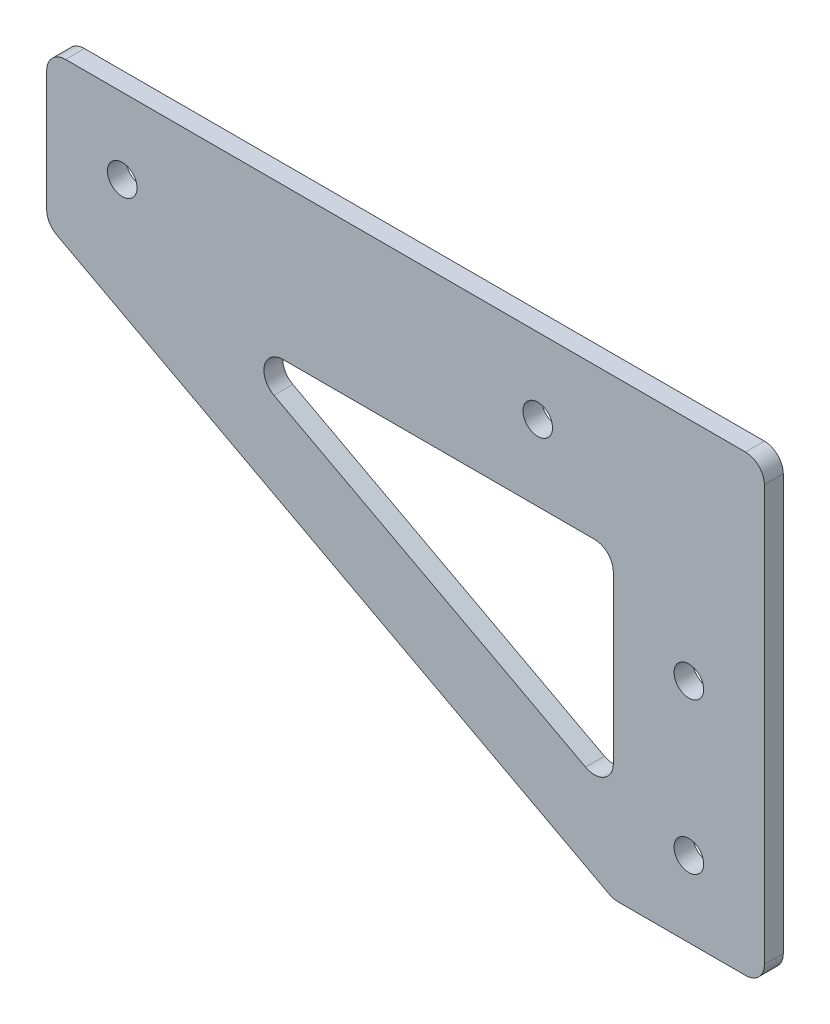
ISO-10303-21;
HEADER;
FILE_DESCRIPTION(('STEP AP214'),'2;1');
FILE_NAME('part.step','',(''),(''),'','','');
FILE_SCHEMA(('AUTOMOTIVE_DESIGN { 1 0 10303 214 1 1 1 1 }'));
ENDSEC;
DATA;
#1=APPLICATION_CONTEXT('core data for automotive mechanical design processes');
#2=APPLICATION_PROTOCOL_DEFINITION('international standard','automotive_design',2000,#1);
#3=PRODUCT_CONTEXT('',#1,'mechanical');
#4=PRODUCT('Part','Part','',(#3));
#5=PRODUCT_RELATED_PRODUCT_CATEGORY('part','',(#4));
#6=PRODUCT_DEFINITION_FORMATION('','',#4);
#7=PRODUCT_DEFINITION_CONTEXT('part definition',#1,'design');
#8=PRODUCT_DEFINITION('design','',#6,#7);
#9=PRODUCT_DEFINITION_SHAPE('','',#8);
#10=(LENGTH_UNIT() NAMED_UNIT(*) SI_UNIT(.MILLI.,.METRE.));
#11=(NAMED_UNIT(*) PLANE_ANGLE_UNIT() SI_UNIT($,.RADIAN.));
#12=(NAMED_UNIT(*) SI_UNIT($,.STERADIAN.) SOLID_ANGLE_UNIT());
#13=UNCERTAINTY_MEASURE_WITH_UNIT(LENGTH_MEASURE(1.E-05),#10,'distance_accuracy_value','');
#14=(GEOMETRIC_REPRESENTATION_CONTEXT(3) GLOBAL_UNCERTAINTY_ASSIGNED_CONTEXT((#13)) GLOBAL_UNIT_ASSIGNED_CONTEXT((#10,
#11,#12)) REPRESENTATION_CONTEXT('',''));
#15=CARTESIAN_POINT('',(0.,0.,0.));
#16=DIRECTION('',(0.,0.,1.));
#17=DIRECTION('',(1.,0.,0.));
#18=AXIS2_PLACEMENT_3D('',#15,#16,#17);
#19=CARTESIAN_POINT('',(0.,0.,3.175));
#20=DIRECTION('',(0.,0.,-1.));
#21=DIRECTION('',(-1.,0.,0.));
#22=AXIS2_PLACEMENT_3D('',#19,#20,#21);
#23=PLANE('',#22);
#24=CARTESIAN_POINT('',(20.3271793714619,68.7268364027863,3.175));
#25=DIRECTION('',(0.,0.,1.));
#26=DIRECTION('',(1.,0.,0.));
#27=AXIS2_PLACEMENT_3D('',#24,#25,#26);
#28=CIRCLE('',#27,2.4892);
#29=CARTESIAN_POINT('',(22.8163793714619,68.7268364027863,3.175));
#30=VERTEX_POINT('',#29);
#31=EDGE_CURVE('E582',#30,#30,#28,.T.);
#32=ORIENTED_EDGE('',*,*,#31,.F.);
#33=EDGE_LOOP('',(#32));
#34=FACE_BOUND('',#33,.T.);
#35=CARTESIAN_POINT('',(115.577179371462,17.9268364027863,3.175));
#36=DIRECTION('',(0.,0.,1.));
#37=DIRECTION('',(1.,0.,0.));
#38=AXIS2_PLACEMENT_3D('',#35,#36,#37);
#39=CIRCLE('',#38,2.4892);
#40=CARTESIAN_POINT('',(118.066379371462,17.9268364027863,3.175));
#41=VERTEX_POINT('',#40);
#42=EDGE_CURVE('E590',#41,#41,#39,.T.);
#43=ORIENTED_EDGE('',*,*,#42,.F.);
#44=EDGE_LOOP('',(#43));
#45=FACE_BOUND('',#44,.T.);
#46=CARTESIAN_POINT('',(90.1771793714619,68.7268364027863,3.175));
#47=DIRECTION('',(0.,0.,1.));
#48=DIRECTION('',(1.,0.,0.));
#49=AXIS2_PLACEMENT_3D('',#46,#47,#48);
#50=CIRCLE('',#49,2.4892);
#51=CARTESIAN_POINT('',(92.6663793714619,68.7268364027863,3.175));
#52=VERTEX_POINT('',#51);
#53=EDGE_CURVE('E574',#52,#52,#50,.T.);
#54=ORIENTED_EDGE('',*,*,#53,.F.);
#55=EDGE_LOOP('',(#54));
#56=FACE_BOUND('',#55,.T.);
#57=CARTESIAN_POINT('',(115.577179371462,43.3268364027863,3.175));
#58=DIRECTION('',(0.,0.,1.));
#59=DIRECTION('',(1.,0.,0.));
#60=AXIS2_PLACEMENT_3D('',#57,#58,#59);
#61=CIRCLE('',#60,2.4892);
#62=CARTESIAN_POINT('',(118.066379371462,43.3268364027863,3.175));
#63=VERTEX_POINT('',#62);
#64=EDGE_CURVE('E570',#63,#63,#61,.T.);
#65=ORIENTED_EDGE('',*,*,#64,.F.);
#66=EDGE_LOOP('',(#65));
#67=FACE_BOUND('',#66,.T.);
#68=DIRECTION('',(0.,1.,0.));
#69=VECTOR('',#68,1.);
#70=CARTESIAN_POINT('',(128.277179371462,5.2268364027863,3.175));
#71=LINE('',#70,#69);
#72=CARTESIAN_POINT('',(128.277179371462,8.4018364027863,3.175));
#73=VERTEX_POINT('',#72);
#74=CARTESIAN_POINT('',(128.277179371462,78.2518364027863,3.175));
#75=VERTEX_POINT('',#74);
#76=EDGE_CURVE('E209',#73,#75,#71,.T.);
#77=ORIENTED_EDGE('',*,*,#76,.T.);
#78=CARTESIAN_POINT('',(125.102179371462,78.2518364027863,3.175));
#79=DIRECTION('',(0.,0.,-1.));
#80=DIRECTION('',(-1.,0.,0.));
#81=AXIS2_PLACEMENT_3D('',#78,#79,#80);
#82=CIRCLE('',#81,3.175);
#83=CARTESIAN_POINT('',(125.102179371462,81.4268364027863,3.175));
#84=VERTEX_POINT('',#83);
#85=EDGE_CURVE('E240',#75,#84,#82,.F.);
#86=ORIENTED_EDGE('',*,*,#85,.T.);
#87=DIRECTION('',(-1.,0.,0.));
#88=VECTOR('',#87,1.);
#89=CARTESIAN_POINT('',(7.62717937146189,81.4268364027863,3.175));
#90=LINE('',#89,#88);
#91=CARTESIAN_POINT('',(10.8021793714619,81.4268364027863,3.175));
#92=VERTEX_POINT('',#91);
#93=EDGE_CURVE('E181',#84,#92,#90,.T.);
#94=ORIENTED_EDGE('',*,*,#93,.T.);
#95=CARTESIAN_POINT('',(10.8021793714619,78.2518364027863,3.175));
#96=DIRECTION('',(0.,0.,-1.));
#97=DIRECTION('',(-1.,0.,0.));
#98=AXIS2_PLACEMENT_3D('',#95,#96,#97);
#99=CIRCLE('',#98,3.175);
#100=CARTESIAN_POINT('',(7.62717937146189,78.2518364027863,3.175));
#101=VERTEX_POINT('',#100);
#102=EDGE_CURVE('E228',#92,#101,#99,.F.);
#103=ORIENTED_EDGE('',*,*,#102,.T.);
#104=DIRECTION('',(0.,-1.,0.));
#105=VECTOR('',#104,1.);
#106=CARTESIAN_POINT('',(7.62717937146189,56.0268364027863,3.175));
#107=LINE('',#106,#105);
#108=CARTESIAN_POINT('',(7.62717937146189,57.9318364027863,3.175));
#109=VERTEX_POINT('',#108);
#110=EDGE_CURVE('E337',#101,#109,#107,.T.);
#111=ORIENTED_EDGE('',*,*,#110,.T.);
#112=CARTESIAN_POINT('',(10.8021793714619,57.9318364027863,3.175));
#113=DIRECTION('',(0.,0.,-1.));
#114=DIRECTION('',(-1.,0.,0.));
#115=AXIS2_PLACEMENT_3D('',#112,#113,#114);
#116=CIRCLE('',#115,3.175);
#117=CARTESIAN_POINT('',(9.30806172440307,55.130365814551,3.175));
#118=VERTEX_POINT('',#117);
#119=EDGE_CURVE('E231',#109,#118,#116,.F.);
#120=ORIENTED_EDGE('',*,*,#119,.T.);
#121=DIRECTION('',(0.882352941176471,-0.470588235294118,0.));
#122=VECTOR('',#121,1.);
#123=CARTESIAN_POINT('',(7.62717937146189,56.0268364027863,3.175));
#124=LINE('',#123,#122);
#125=CARTESIAN_POINT('',(102.176811724403,5.60036581455101,3.175));
#126=VERTEX_POINT('',#125);
#127=EDGE_CURVE('E341',#118,#126,#124,.T.);
#128=ORIENTED_EDGE('',*,*,#127,.T.);
#129=CARTESIAN_POINT('',(103.670929371462,8.4018364027863,3.175));
#130=DIRECTION('',(0.,0.,-1.));
#131=DIRECTION('',(-1.,0.,0.));
#132=AXIS2_PLACEMENT_3D('',#129,#130,#131);
#133=CIRCLE('',#132,3.175);
#134=CARTESIAN_POINT('',(103.670929371462,5.2268364027863,3.175));
#135=VERTEX_POINT('',#134);
#136=EDGE_CURVE('E234',#126,#135,#133,.F.);
#137=ORIENTED_EDGE('',*,*,#136,.T.);
#138=DIRECTION('',(1.,0.,0.));
#139=VECTOR('',#138,1.);
#140=CARTESIAN_POINT('',(102.877179371462,5.2268364027863,3.175));
#141=LINE('',#140,#139);
#142=CARTESIAN_POINT('',(125.102179371462,5.2268364027863,3.175));
#143=VERTEX_POINT('',#142);
#144=EDGE_CURVE('E211',#135,#143,#141,.T.);
#145=ORIENTED_EDGE('',*,*,#144,.T.);
#146=CARTESIAN_POINT('',(125.102179371462,8.4018364027863,3.175));
#147=DIRECTION('',(0.,0.,-1.));
#148=DIRECTION('',(-1.,0.,0.));
#149=AXIS2_PLACEMENT_3D('',#146,#147,#148);
#150=CIRCLE('',#149,3.175);
#151=EDGE_CURVE('E237',#143,#73,#150,.F.);
#152=ORIENTED_EDGE('',*,*,#151,.T.);
#153=EDGE_LOOP('',(#77,#86,#94,#103,#111,#120,#128,#137,#145,#152));
#154=FACE_BOUND('',#153,.T.);
#155=DIRECTION('',(0.88235294117647,-0.470588235294118,0.));
#156=VECTOR('',#155,1.);
#157=CARTESIAN_POINT('',(102.877179371462,19.6201697361196,3.175));
#158=LINE('',#157,#156);
#159=CARTESIAN_POINT('',(45.820561724403,50.050365814551,3.175));
#160=VERTEX_POINT('',#159);
#161=CARTESIAN_POINT('',(98.2080617244031,22.110365814551,3.175));
#162=VERTEX_POINT('',#161);
#163=EDGE_CURVE('E317',#160,#162,#158,.T.);
#164=ORIENTED_EDGE('',*,*,#163,.F.);
#165=CARTESIAN_POINT('',(47.3146793714618,52.8518364027863,3.175));
#166=DIRECTION('',(0.,0.,-1.));
#167=DIRECTION('',(-1.,0.,0.));
#168=AXIS2_PLACEMENT_3D('',#165,#166,#167);
#169=CIRCLE('',#168,3.175);
#170=CARTESIAN_POINT('',(47.3146793714618,56.0268364027863,3.175));
#171=VERTEX_POINT('',#170);
#172=EDGE_CURVE('E11',#160,#171,#169,.T.);
#173=ORIENTED_EDGE('',*,*,#172,.T.);
#174=DIRECTION('',(-1.,0.,0.));
#175=VECTOR('',#174,1.);
#176=CARTESIAN_POINT('',(34.6146793714618,56.0268364027863,3.175));
#177=LINE('',#176,#175);
#178=CARTESIAN_POINT('',(99.7021793714619,56.0268364027863,3.175));
#179=VERTEX_POINT('',#178);
#180=EDGE_CURVE('E198',#179,#171,#177,.T.);
#181=ORIENTED_EDGE('',*,*,#180,.F.);
#182=CARTESIAN_POINT('',(99.7021793714619,52.8518364027863,3.175));
#183=DIRECTION('',(0.,0.,-1.));
#184=DIRECTION('',(-1.,0.,0.));
#185=AXIS2_PLACEMENT_3D('',#182,#183,#184);
#186=CIRCLE('',#185,3.175);
#187=CARTESIAN_POINT('',(102.877179371462,52.8518364027863,3.175));
#188=VERTEX_POINT('',#187);
#189=EDGE_CURVE('E61',#179,#188,#186,.T.);
#190=ORIENTED_EDGE('',*,*,#189,.T.);
#191=DIRECTION('',(0.,1.,0.));
#192=VECTOR('',#191,1.);
#193=CARTESIAN_POINT('',(102.877179371462,56.0268364027863,3.175));
#194=LINE('',#193,#192);
#195=CARTESIAN_POINT('',(102.877179371462,24.9118364027863,3.175));
#196=VERTEX_POINT('',#195);
#197=EDGE_CURVE('E322',#196,#188,#194,.T.);
#198=ORIENTED_EDGE('',*,*,#197,.F.);
#199=CARTESIAN_POINT('',(99.7021793714619,24.9118364027863,3.175));
#200=DIRECTION('',(0.,0.,-1.));
#201=DIRECTION('',(-1.,0.,0.));
#202=AXIS2_PLACEMENT_3D('',#199,#200,#201);
#203=CIRCLE('',#202,3.175);
#204=EDGE_CURVE('E287',#196,#162,#203,.T.);
#205=ORIENTED_EDGE('',*,*,#204,.T.);
#206=EDGE_LOOP('',(#164,#173,#181,#190,#198,#205));
#207=FACE_BOUND('',#206,.T.);
#208=ADVANCED_FACE('F45',(#34,#45,#56,#67,#154,#207),#23,.F.);
#209=CARTESIAN_POINT('',(0.,0.,0.));
#210=DIRECTION('',(0.,0.,-1.));
#211=DIRECTION('',(-1.,0.,0.));
#212=AXIS2_PLACEMENT_3D('',#209,#210,#211);
#213=PLANE('',#212);
#214=CARTESIAN_POINT('',(20.3271793714619,68.7268364027863,0.));
#215=DIRECTION('',(0.,0.,1.));
#216=DIRECTION('',(1.,0.,0.));
#217=AXIS2_PLACEMENT_3D('',#214,#215,#216);
#218=CIRCLE('',#217,2.4892);
#219=CARTESIAN_POINT('',(22.8163793714619,68.7268364027863,0.));
#220=VERTEX_POINT('',#219);
#221=EDGE_CURVE('E578',#220,#220,#218,.T.);
#222=ORIENTED_EDGE('',*,*,#221,.T.);
#223=EDGE_LOOP('',(#222));
#224=FACE_BOUND('',#223,.T.);
#225=CARTESIAN_POINT('',(115.577179371462,17.9268364027863,0.));
#226=DIRECTION('',(0.,0.,1.));
#227=DIRECTION('',(1.,0.,0.));
#228=AXIS2_PLACEMENT_3D('',#225,#226,#227);
#229=CIRCLE('',#228,2.4892);
#230=CARTESIAN_POINT('',(118.066379371462,17.9268364027863,0.));
#231=VERTEX_POINT('',#230);
#232=EDGE_CURVE('E586',#231,#231,#229,.T.);
#233=ORIENTED_EDGE('',*,*,#232,.T.);
#234=EDGE_LOOP('',(#233));
#235=FACE_BOUND('',#234,.T.);
#236=CARTESIAN_POINT('',(90.1771793714619,68.7268364027863,0.));
#237=DIRECTION('',(0.,0.,1.));
#238=DIRECTION('',(1.,0.,0.));
#239=AXIS2_PLACEMENT_3D('',#236,#237,#238);
#240=CIRCLE('',#239,2.4892);
#241=CARTESIAN_POINT('',(92.6663793714619,68.7268364027863,0.));
#242=VERTEX_POINT('',#241);
#243=EDGE_CURVE('E594',#242,#242,#240,.T.);
#244=ORIENTED_EDGE('',*,*,#243,.T.);
#245=EDGE_LOOP('',(#244));
#246=FACE_BOUND('',#245,.T.);
#247=CARTESIAN_POINT('',(115.577179371462,43.3268364027863,0.));
#248=DIRECTION('',(0.,0.,1.));
#249=DIRECTION('',(1.,0.,0.));
#250=AXIS2_PLACEMENT_3D('',#247,#248,#249);
#251=CIRCLE('',#250,2.4892);
#252=CARTESIAN_POINT('',(118.066379371462,43.3268364027863,0.));
#253=VERTEX_POINT('',#252);
#254=EDGE_CURVE('E312',#253,#253,#251,.T.);
#255=ORIENTED_EDGE('',*,*,#254,.T.);
#256=EDGE_LOOP('',(#255));
#257=FACE_BOUND('',#256,.T.);
#258=DIRECTION('',(-1.,0.,0.));
#259=VECTOR('',#258,1.);
#260=CARTESIAN_POINT('',(7.62717937146189,81.4268364027863,0.));
#261=LINE('',#260,#259);
#262=CARTESIAN_POINT('',(125.102179371462,81.4268364027863,0.));
#263=VERTEX_POINT('',#262);
#264=CARTESIAN_POINT('',(10.8021793714619,81.4268364027863,0.));
#265=VERTEX_POINT('',#264);
#266=EDGE_CURVE('E178',#263,#265,#261,.T.);
#267=ORIENTED_EDGE('',*,*,#266,.F.);
#268=CARTESIAN_POINT('',(125.102179371462,78.2518364027863,0.));
#269=DIRECTION('',(0.,0.,-1.));
#270=DIRECTION('',(-1.,0.,0.));
#271=AXIS2_PLACEMENT_3D('',#268,#269,#270);
#272=CIRCLE('',#271,3.175);
#273=CARTESIAN_POINT('',(128.277179371462,78.2518364027863,0.));
#274=VERTEX_POINT('',#273);
#275=EDGE_CURVE('E160',#263,#274,#272,.T.);
#276=ORIENTED_EDGE('',*,*,#275,.T.);
#277=DIRECTION('',(0.,1.,0.));
#278=VECTOR('',#277,1.);
#279=CARTESIAN_POINT('',(128.277179371462,5.2268364027863,0.));
#280=LINE('',#279,#278);
#281=CARTESIAN_POINT('',(128.277179371462,8.4018364027863,0.));
#282=VERTEX_POINT('',#281);
#283=EDGE_CURVE('E191',#282,#274,#280,.T.);
#284=ORIENTED_EDGE('',*,*,#283,.F.);
#285=CARTESIAN_POINT('',(125.102179371462,8.4018364027863,0.));
#286=DIRECTION('',(0.,0.,-1.));
#287=DIRECTION('',(-1.,0.,0.));
#288=AXIS2_PLACEMENT_3D('',#285,#286,#287);
#289=CIRCLE('',#288,3.175);
#290=CARTESIAN_POINT('',(125.102179371462,5.2268364027863,0.));
#291=VERTEX_POINT('',#290);
#292=EDGE_CURVE('E172',#282,#291,#289,.T.);
#293=ORIENTED_EDGE('',*,*,#292,.T.);
#294=DIRECTION('',(1.,0.,0.));
#295=VECTOR('',#294,1.);
#296=CARTESIAN_POINT('',(102.877179371462,5.2268364027863,0.));
#297=LINE('',#296,#295);
#298=CARTESIAN_POINT('',(103.670929371462,5.2268364027863,0.));
#299=VERTEX_POINT('',#298);
#300=EDGE_CURVE('E205',#299,#291,#297,.T.);
#301=ORIENTED_EDGE('',*,*,#300,.F.);
#302=CARTESIAN_POINT('',(103.670929371462,8.4018364027863,0.));
#303=DIRECTION('',(0.,0.,-1.));
#304=DIRECTION('',(-1.,0.,0.));
#305=AXIS2_PLACEMENT_3D('',#302,#303,#304);
#306=CIRCLE('',#305,3.175);
#307=CARTESIAN_POINT('',(102.176811724403,5.60036581455101,0.));
#308=VERTEX_POINT('',#307);
#309=EDGE_CURVE('E218',#299,#308,#306,.T.);
#310=ORIENTED_EDGE('',*,*,#309,.T.);
#311=DIRECTION('',(0.882352941176471,-0.470588235294118,0.));
#312=VECTOR('',#311,1.);
#313=CARTESIAN_POINT('',(7.62717937146189,56.0268364027863,0.));
#314=LINE('',#313,#312);
#315=CARTESIAN_POINT('',(9.30806172440307,55.130365814551,0.));
#316=VERTEX_POINT('',#315);
#317=EDGE_CURVE('E196',#316,#308,#314,.T.);
#318=ORIENTED_EDGE('',*,*,#317,.F.);
#319=CARTESIAN_POINT('',(10.8021793714619,57.9318364027863,0.));
#320=DIRECTION('',(0.,0.,-1.));
#321=DIRECTION('',(-1.,0.,0.));
#322=AXIS2_PLACEMENT_3D('',#319,#320,#321);
#323=CIRCLE('',#322,3.175);
#324=CARTESIAN_POINT('',(7.62717937146189,57.9318364027863,0.));
#325=VERTEX_POINT('',#324);
#326=EDGE_CURVE('E215',#316,#325,#323,.T.);
#327=ORIENTED_EDGE('',*,*,#326,.T.);
#328=DIRECTION('',(0.,-1.,0.));
#329=VECTOR('',#328,1.);
#330=CARTESIAN_POINT('',(7.62717937146189,56.0268364027863,0.));
#331=LINE('',#330,#329);
#332=CARTESIAN_POINT('',(7.62717937146189,78.2518364027863,0.));
#333=VERTEX_POINT('',#332);
#334=EDGE_CURVE('E190',#333,#325,#331,.T.);
#335=ORIENTED_EDGE('',*,*,#334,.F.);
#336=CARTESIAN_POINT('',(10.8021793714619,78.2518364027863,0.));
#337=DIRECTION('',(0.,0.,-1.));
#338=DIRECTION('',(-1.,0.,0.));
#339=AXIS2_PLACEMENT_3D('',#336,#337,#338);
#340=CIRCLE('',#339,3.175);
#341=EDGE_CURVE('E183',#333,#265,#340,.T.);
#342=ORIENTED_EDGE('',*,*,#341,.T.);
#343=EDGE_LOOP('',(#267,#276,#284,#293,#301,#310,#318,#327,#335,#342));
#344=FACE_BOUND('',#343,.T.);
#345=DIRECTION('',(0.,1.,0.));
#346=VECTOR('',#345,1.);
#347=CARTESIAN_POINT('',(102.877179371462,56.0268364027863,0.));
#348=LINE('',#347,#346);
#349=CARTESIAN_POINT('',(102.877179371462,24.9118364027863,0.));
#350=VERTEX_POINT('',#349);
#351=CARTESIAN_POINT('',(102.877179371462,52.8518364027863,0.));
#352=VERTEX_POINT('',#351);
#353=EDGE_CURVE('E311',#350,#352,#348,.T.);
#354=ORIENTED_EDGE('',*,*,#353,.T.);
#355=CARTESIAN_POINT('',(99.7021793714619,52.8518364027863,0.));
#356=DIRECTION('',(0.,0.,-1.));
#357=DIRECTION('',(-1.,0.,0.));
#358=AXIS2_PLACEMENT_3D('',#355,#356,#357);
#359=CIRCLE('',#358,3.175);
#360=CARTESIAN_POINT('',(99.7021793714619,56.0268364027863,0.));
#361=VERTEX_POINT('',#360);
#362=EDGE_CURVE('E290',#352,#361,#359,.F.);
#363=ORIENTED_EDGE('',*,*,#362,.T.);
#364=DIRECTION('',(-1.,0.,0.));
#365=VECTOR('',#364,1.);
#366=CARTESIAN_POINT('',(34.6146793714618,56.0268364027863,0.));
#367=LINE('',#366,#365);
#368=CARTESIAN_POINT('',(47.3146793714618,56.0268364027863,0.));
#369=VERTEX_POINT('',#368);
#370=EDGE_CURVE('E301',#361,#369,#367,.T.);
#371=ORIENTED_EDGE('',*,*,#370,.T.);
#372=CARTESIAN_POINT('',(47.3146793714618,52.8518364027863,0.));
#373=DIRECTION('',(0.,0.,-1.));
#374=DIRECTION('',(-1.,0.,0.));
#375=AXIS2_PLACEMENT_3D('',#372,#373,#374);
#376=CIRCLE('',#375,3.175);
#377=CARTESIAN_POINT('',(45.820561724403,50.050365814551,0.));
#378=VERTEX_POINT('',#377);
#379=EDGE_CURVE('E54',#369,#378,#376,.F.);
#380=ORIENTED_EDGE('',*,*,#379,.T.);
#381=DIRECTION('',(0.88235294117647,-0.470588235294118,0.));
#382=VECTOR('',#381,1.);
#383=CARTESIAN_POINT('',(102.877179371462,19.6201697361196,0.));
#384=LINE('',#383,#382);
#385=CARTESIAN_POINT('',(98.2080617244031,22.110365814551,0.));
#386=VERTEX_POINT('',#385);
#387=EDGE_CURVE('E299',#378,#386,#384,.T.);
#388=ORIENTED_EDGE('',*,*,#387,.T.);
#389=CARTESIAN_POINT('',(99.7021793714619,24.9118364027863,0.));
#390=DIRECTION('',(0.,0.,-1.));
#391=DIRECTION('',(-1.,0.,0.));
#392=AXIS2_PLACEMENT_3D('',#389,#390,#391);
#393=CIRCLE('',#392,3.175);
#394=EDGE_CURVE('E284',#386,#350,#393,.F.);
#395=ORIENTED_EDGE('',*,*,#394,.T.);
#396=EDGE_LOOP('',(#354,#363,#371,#380,#388,#395));
#397=FACE_BOUND('',#396,.T.);
#398=ADVANCED_FACE('F186',(#224,#235,#246,#257,#344,#397),#213,.T.);
#399=CARTESIAN_POINT('',(128.277179371462,5.2268364027863,3.175));
#400=DIRECTION('',(-1.,0.,0.));
#401=DIRECTION('',(0.,0.,1.));
#402=AXIS2_PLACEMENT_3D('',#399,#400,#401);
#403=PLANE('',#402);
#404=ORIENTED_EDGE('',*,*,#283,.T.);
#405=DIRECTION('',(0.,0.,-1.));
#406=VECTOR('',#405,1.);
#407=CARTESIAN_POINT('',(128.277179371462,78.2518364027863,3.175));
#408=LINE('',#407,#406);
#409=EDGE_CURVE('E165',#274,#75,#408,.F.);
#410=ORIENTED_EDGE('',*,*,#409,.T.);
#411=ORIENTED_EDGE('',*,*,#76,.F.);
#412=DIRECTION('',(0.,0.,-1.));
#413=VECTOR('',#412,1.);
#414=CARTESIAN_POINT('',(128.277179371462,8.4018364027863,3.175));
#415=LINE('',#414,#413);
#416=EDGE_CURVE('E171',#73,#282,#415,.T.);
#417=ORIENTED_EDGE('',*,*,#416,.T.);
#418=EDGE_LOOP('',(#404,#410,#411,#417));
#419=FACE_BOUND('',#418,.T.);
#420=ADVANCED_FACE('F358',(#419),#403,.F.);
#421=CARTESIAN_POINT('',(7.62717937146189,81.4268364027863,3.175));
#422=DIRECTION('',(0.,-1.,0.));
#423=DIRECTION('',(0.,0.,-1.));
#424=AXIS2_PLACEMENT_3D('',#421,#422,#423);
#425=PLANE('',#424);
#426=ORIENTED_EDGE('',*,*,#93,.F.);
#427=DIRECTION('',(0.,0.,-1.));
#428=VECTOR('',#427,1.);
#429=CARTESIAN_POINT('',(125.102179371462,81.4268364027863,3.175));
#430=LINE('',#429,#428);
#431=EDGE_CURVE('E164',#84,#263,#430,.T.);
#432=ORIENTED_EDGE('',*,*,#431,.T.);
#433=ORIENTED_EDGE('',*,*,#266,.T.);
#434=DIRECTION('',(0.,0.,-1.));
#435=VECTOR('',#434,1.);
#436=CARTESIAN_POINT('',(10.8021793714619,81.4268364027863,3.175));
#437=LINE('',#436,#435);
#438=EDGE_CURVE('E184',#265,#92,#437,.F.);
#439=ORIENTED_EDGE('',*,*,#438,.T.);
#440=EDGE_LOOP('',(#426,#432,#433,#439));
#441=FACE_BOUND('',#440,.T.);
#442=ADVANCED_FACE('F177',(#441),#425,.F.);
#443=CARTESIAN_POINT('',(7.62717937146189,56.0268364027863,3.175));
#444=DIRECTION('',(1.,0.,0.));
#445=DIRECTION('',(0.,0.,-1.));
#446=AXIS2_PLACEMENT_3D('',#443,#444,#445);
#447=PLANE('',#446);
#448=ORIENTED_EDGE('',*,*,#334,.T.);
#449=DIRECTION('',(0.,0.,-1.));
#450=VECTOR('',#449,1.);
#451=CARTESIAN_POINT('',(7.62717937146189,57.9318364027863,3.175));
#452=LINE('',#451,#450);
#453=EDGE_CURVE('E281',#325,#109,#452,.F.);
#454=ORIENTED_EDGE('',*,*,#453,.T.);
#455=ORIENTED_EDGE('',*,*,#110,.F.);
#456=DIRECTION('',(0.,0.,-1.));
#457=VECTOR('',#456,1.);
#458=CARTESIAN_POINT('',(7.62717937146189,78.2518364027863,3.175));
#459=LINE('',#458,#457);
#460=EDGE_CURVE('E277',#101,#333,#459,.T.);
#461=ORIENTED_EDGE('',*,*,#460,.T.);
#462=EDGE_LOOP('',(#448,#454,#455,#461));
#463=FACE_BOUND('',#462,.T.);
#464=ADVANCED_FACE('F374',(#463),#447,.F.);
#465=CARTESIAN_POINT('',(7.62717937146189,56.0268364027863,3.175));
#466=DIRECTION('',(0.470588235294118,0.88235294117647,0.));
#467=DIRECTION('',(-0.882352941176471,0.470588235294118,0.));
#468=AXIS2_PLACEMENT_3D('',#465,#466,#467);
#469=PLANE('',#468);
#470=ORIENTED_EDGE('',*,*,#317,.T.);
#471=DIRECTION('',(0.,0.,-1.));
#472=VECTOR('',#471,1.);
#473=CARTESIAN_POINT('',(102.176811724403,5.60036581455101,3.175));
#474=LINE('',#473,#472);
#475=EDGE_CURVE('E254',#308,#126,#474,.F.);
#476=ORIENTED_EDGE('',*,*,#475,.T.);
#477=ORIENTED_EDGE('',*,*,#127,.F.);
#478=DIRECTION('',(0.,0.,-1.));
#479=VECTOR('',#478,1.);
#480=CARTESIAN_POINT('',(9.30806172440307,55.130365814551,3.175));
#481=LINE('',#480,#479);
#482=EDGE_CURVE('E250',#118,#316,#481,.T.);
#483=ORIENTED_EDGE('',*,*,#482,.T.);
#484=EDGE_LOOP('',(#470,#476,#477,#483));
#485=FACE_BOUND('',#484,.T.);
#486=ADVANCED_FACE('F366',(#485),#469,.F.);
#487=CARTESIAN_POINT('',(102.877179371462,5.2268364027863,3.175));
#488=DIRECTION('',(0.,1.,0.));
#489=DIRECTION('',(0.,0.,1.));
#490=AXIS2_PLACEMENT_3D('',#487,#488,#489);
#491=PLANE('',#490);
#492=ORIENTED_EDGE('',*,*,#300,.T.);
#493=DIRECTION('',(0.,0.,-1.));
#494=VECTOR('',#493,1.);
#495=CARTESIAN_POINT('',(125.102179371462,5.2268364027863,3.175));
#496=LINE('',#495,#494);
#497=EDGE_CURVE('E247',#291,#143,#496,.F.);
#498=ORIENTED_EDGE('',*,*,#497,.T.);
#499=ORIENTED_EDGE('',*,*,#144,.F.);
#500=DIRECTION('',(0.,0.,-1.));
#501=VECTOR('',#500,1.);
#502=CARTESIAN_POINT('',(103.670929371462,5.2268364027863,3.175));
#503=LINE('',#502,#501);
#504=EDGE_CURVE('E243',#135,#299,#503,.T.);
#505=ORIENTED_EDGE('',*,*,#504,.T.);
#506=EDGE_LOOP('',(#492,#498,#499,#505));
#507=FACE_BOUND('',#506,.T.);
#508=ADVANCED_FACE('F360',(#507),#491,.F.);
#509=CARTESIAN_POINT('',(102.877179371462,19.6201697361196,3.175));
#510=DIRECTION('',(0.470588235294118,0.882352941176471,0.));
#511=DIRECTION('',(-0.882352941176471,0.470588235294118,0.));
#512=AXIS2_PLACEMENT_3D('',#509,#510,#511);
#513=PLANE('',#512);
#514=ORIENTED_EDGE('',*,*,#163,.T.);
#515=DIRECTION('',(0.,0.,-1.));
#516=VECTOR('',#515,1.);
#517=CARTESIAN_POINT('',(98.2080617244031,22.110365814551,0.));
#518=LINE('',#517,#516);
#519=EDGE_CURVE('E260',#162,#386,#518,.T.);
#520=ORIENTED_EDGE('',*,*,#519,.T.);
#521=ORIENTED_EDGE('',*,*,#387,.F.);
#522=DIRECTION('',(0.,0.,-1.));
#523=VECTOR('',#522,1.);
#524=CARTESIAN_POINT('',(45.820561724403,50.050365814551,3.175));
#525=LINE('',#524,#523);
#526=EDGE_CURVE('E257',#378,#160,#525,.F.);
#527=ORIENTED_EDGE('',*,*,#526,.T.);
#528=EDGE_LOOP('',(#514,#520,#521,#527));
#529=FACE_BOUND('',#528,.T.);
#530=ADVANCED_FACE('F307',(#529),#513,.T.);
#531=CARTESIAN_POINT('',(102.877179371462,56.0268364027863,3.175));
#532=DIRECTION('',(-1.,0.,0.));
#533=DIRECTION('',(0.,0.,1.));
#534=AXIS2_PLACEMENT_3D('',#531,#532,#533);
#535=PLANE('',#534);
#536=ORIENTED_EDGE('',*,*,#353,.F.);
#537=DIRECTION('',(0.,0.,-1.));
#538=VECTOR('',#537,1.);
#539=CARTESIAN_POINT('',(102.877179371462,24.9118364027863,3.175));
#540=LINE('',#539,#538);
#541=EDGE_CURVE('E68',#350,#196,#540,.F.);
#542=ORIENTED_EDGE('',*,*,#541,.T.);
#543=ORIENTED_EDGE('',*,*,#197,.T.);
#544=DIRECTION('',(0.,0.,-1.));
#545=VECTOR('',#544,1.);
#546=CARTESIAN_POINT('',(102.877179371462,52.8518364027863,0.));
#547=LINE('',#546,#545);
#548=EDGE_CURVE('E264',#188,#352,#547,.T.);
#549=ORIENTED_EDGE('',*,*,#548,.T.);
#550=EDGE_LOOP('',(#536,#542,#543,#549));
#551=FACE_BOUND('',#550,.T.);
#552=ADVANCED_FACE('F504',(#551),#535,.T.);
#553=CARTESIAN_POINT('',(34.6146793714618,56.0268364027863,3.175));
#554=DIRECTION('',(0.,-1.,0.));
#555=DIRECTION('',(0.,0.,-1.));
#556=AXIS2_PLACEMENT_3D('',#553,#554,#555);
#557=PLANE('',#556);
#558=ORIENTED_EDGE('',*,*,#370,.F.);
#559=DIRECTION('',(0.,0.,-1.));
#560=VECTOR('',#559,1.);
#561=CARTESIAN_POINT('',(99.7021793714619,56.0268364027863,3.175));
#562=LINE('',#561,#560);
#563=EDGE_CURVE('E274',#361,#179,#562,.F.);
#564=ORIENTED_EDGE('',*,*,#563,.T.);
#565=ORIENTED_EDGE('',*,*,#180,.T.);
#566=DIRECTION('',(0.,0.,-1.));
#567=VECTOR('',#566,1.);
#568=CARTESIAN_POINT('',(47.3146793714618,56.0268364027863,0.));
#569=LINE('',#568,#567);
#570=EDGE_CURVE('E270',#171,#369,#569,.T.);
#571=ORIENTED_EDGE('',*,*,#570,.T.);
#572=EDGE_LOOP('',(#558,#564,#565,#571));
#573=FACE_BOUND('',#572,.T.);
#574=ADVANCED_FACE('F319',(#573),#557,.T.);
#575=CARTESIAN_POINT('',(115.577179371462,43.3268364027863,0.));
#576=DIRECTION('',(0.,0.,1.));
#577=DIRECTION('',(1.,0.,0.));
#578=AXIS2_PLACEMENT_3D('',#575,#576,#577);
#579=CYLINDRICAL_SURFACE('',#578,2.4892);
#580=ORIENTED_EDGE('',*,*,#254,.F.);
#581=EDGE_LOOP('',(#580));
#582=FACE_BOUND('',#581,.T.);
#583=ORIENTED_EDGE('',*,*,#64,.T.);
#584=EDGE_LOOP('',(#583));
#585=FACE_BOUND('',#584,.T.);
#586=ADVANCED_FACE('F487',(#582,#585),#579,.F.);
#587=CARTESIAN_POINT('',(90.1771793714619,68.7268364027863,0.));
#588=DIRECTION('',(0.,0.,1.));
#589=DIRECTION('',(1.,0.,0.));
#590=AXIS2_PLACEMENT_3D('',#587,#588,#589);
#591=CYLINDRICAL_SURFACE('',#590,2.4892);
#592=ORIENTED_EDGE('',*,*,#243,.F.);
#593=EDGE_LOOP('',(#592));
#594=FACE_BOUND('',#593,.T.);
#595=ORIENTED_EDGE('',*,*,#53,.T.);
#596=EDGE_LOOP('',(#595));
#597=FACE_BOUND('',#596,.T.);
#598=ADVANCED_FACE('F478',(#594,#597),#591,.F.);
#599=CARTESIAN_POINT('',(115.577179371462,17.9268364027863,0.));
#600=DIRECTION('',(0.,0.,1.));
#601=DIRECTION('',(1.,0.,0.));
#602=AXIS2_PLACEMENT_3D('',#599,#600,#601);
#603=CYLINDRICAL_SURFACE('',#602,2.4892);
#604=ORIENTED_EDGE('',*,*,#232,.F.);
#605=EDGE_LOOP('',(#604));
#606=FACE_BOUND('',#605,.T.);
#607=ORIENTED_EDGE('',*,*,#42,.T.);
#608=EDGE_LOOP('',(#607));
#609=FACE_BOUND('',#608,.T.);
#610=ADVANCED_FACE('F469',(#606,#609),#603,.F.);
#611=CARTESIAN_POINT('',(20.3271793714619,68.7268364027863,0.));
#612=DIRECTION('',(0.,0.,1.));
#613=DIRECTION('',(1.,0.,0.));
#614=AXIS2_PLACEMENT_3D('',#611,#612,#613);
#615=CYLINDRICAL_SURFACE('',#614,2.4892);
#616=ORIENTED_EDGE('',*,*,#221,.F.);
#617=EDGE_LOOP('',(#616));
#618=FACE_BOUND('',#617,.T.);
#619=ORIENTED_EDGE('',*,*,#31,.T.);
#620=EDGE_LOOP('',(#619));
#621=FACE_BOUND('',#620,.T.);
#622=ADVANCED_FACE('F409',(#618,#621),#615,.F.);
#623=CARTESIAN_POINT('',(125.102179371462,78.2518364027863,3.175));
#624=DIRECTION('',(0.,0.,-1.));
#625=DIRECTION('',(-1.,0.,0.));
#626=AXIS2_PLACEMENT_3D('',#623,#624,#625);
#627=CYLINDRICAL_SURFACE('',#626,3.175);
#628=ORIENTED_EDGE('',*,*,#85,.F.);
#629=ORIENTED_EDGE('',*,*,#409,.F.);
#630=ORIENTED_EDGE('',*,*,#275,.F.);
#631=ORIENTED_EDGE('',*,*,#431,.F.);
#632=EDGE_LOOP('',(#628,#629,#630,#631));
#633=FACE_BOUND('',#632,.T.);
#634=ADVANCED_FACE('F163',(#633),#627,.T.);
#635=CARTESIAN_POINT('',(125.102179371462,8.4018364027863,3.175));
#636=DIRECTION('',(0.,0.,-1.));
#637=DIRECTION('',(-1.,0.,0.));
#638=AXIS2_PLACEMENT_3D('',#635,#636,#637);
#639=CYLINDRICAL_SURFACE('',#638,3.175);
#640=ORIENTED_EDGE('',*,*,#151,.F.);
#641=ORIENTED_EDGE('',*,*,#497,.F.);
#642=ORIENTED_EDGE('',*,*,#292,.F.);
#643=ORIENTED_EDGE('',*,*,#416,.F.);
#644=EDGE_LOOP('',(#640,#641,#642,#643));
#645=FACE_BOUND('',#644,.T.);
#646=ADVANCED_FACE('F356',(#645),#639,.T.);
#647=CARTESIAN_POINT('',(103.670929371462,8.4018364027863,3.175));
#648=DIRECTION('',(0.,0.,-1.));
#649=DIRECTION('',(-1.,0.,0.));
#650=AXIS2_PLACEMENT_3D('',#647,#648,#649);
#651=CYLINDRICAL_SURFACE('',#650,3.175);
#652=ORIENTED_EDGE('',*,*,#136,.F.);
#653=ORIENTED_EDGE('',*,*,#475,.F.);
#654=ORIENTED_EDGE('',*,*,#309,.F.);
#655=ORIENTED_EDGE('',*,*,#504,.F.);
#656=EDGE_LOOP('',(#652,#653,#654,#655));
#657=FACE_BOUND('',#656,.T.);
#658=ADVANCED_FACE('F362',(#657),#651,.T.);
#659=CARTESIAN_POINT('',(99.7021793714619,24.9118364027863,3.175));
#660=DIRECTION('',(0.,0.,1.));
#661=DIRECTION('',(1.,0.,0.));
#662=AXIS2_PLACEMENT_3D('',#659,#660,#661);
#663=CYLINDRICAL_SURFACE('',#662,3.175);
#664=ORIENTED_EDGE('',*,*,#204,.F.);
#665=ORIENTED_EDGE('',*,*,#541,.F.);
#666=ORIENTED_EDGE('',*,*,#394,.F.);
#667=ORIENTED_EDGE('',*,*,#519,.F.);
#668=EDGE_LOOP('',(#664,#665,#666,#667));
#669=FACE_BOUND('',#668,.T.);
#670=ADVANCED_FACE('F414',(#669),#663,.F.);
#671=CARTESIAN_POINT('',(99.7021793714619,52.8518364027863,3.175));
#672=DIRECTION('',(0.,0.,1.));
#673=DIRECTION('',(1.,0.,0.));
#674=AXIS2_PLACEMENT_3D('',#671,#672,#673);
#675=CYLINDRICAL_SURFACE('',#674,3.175);
#676=ORIENTED_EDGE('',*,*,#189,.F.);
#677=ORIENTED_EDGE('',*,*,#563,.F.);
#678=ORIENTED_EDGE('',*,*,#362,.F.);
#679=ORIENTED_EDGE('',*,*,#548,.F.);
#680=EDGE_LOOP('',(#676,#677,#678,#679));
#681=FACE_BOUND('',#680,.T.);
#682=ADVANCED_FACE('F417',(#681),#675,.F.);
#683=CARTESIAN_POINT('',(47.3146793714618,52.8518364027863,3.175));
#684=DIRECTION('',(0.,0.,1.));
#685=DIRECTION('',(1.,0.,0.));
#686=AXIS2_PLACEMENT_3D('',#683,#684,#685);
#687=CYLINDRICAL_SURFACE('',#686,3.175);
#688=ORIENTED_EDGE('',*,*,#172,.F.);
#689=ORIENTED_EDGE('',*,*,#526,.F.);
#690=ORIENTED_EDGE('',*,*,#379,.F.);
#691=ORIENTED_EDGE('',*,*,#570,.F.);
#692=EDGE_LOOP('',(#688,#689,#690,#691));
#693=FACE_BOUND('',#692,.T.);
#694=ADVANCED_FACE('F315',(#693),#687,.F.);
#695=CARTESIAN_POINT('',(10.8021793714619,57.9318364027863,3.175));
#696=DIRECTION('',(0.,0.,-1.));
#697=DIRECTION('',(-1.,0.,0.));
#698=AXIS2_PLACEMENT_3D('',#695,#696,#697);
#699=CYLINDRICAL_SURFACE('',#698,3.175);
#700=ORIENTED_EDGE('',*,*,#119,.F.);
#701=ORIENTED_EDGE('',*,*,#453,.F.);
#702=ORIENTED_EDGE('',*,*,#326,.F.);
#703=ORIENTED_EDGE('',*,*,#482,.F.);
#704=EDGE_LOOP('',(#700,#701,#702,#703));
#705=FACE_BOUND('',#704,.T.);
#706=ADVANCED_FACE('F371',(#705),#699,.T.);
#707=CARTESIAN_POINT('',(10.8021793714619,78.2518364027863,3.175));
#708=DIRECTION('',(0.,0.,-1.));
#709=DIRECTION('',(-1.,0.,0.));
#710=AXIS2_PLACEMENT_3D('',#707,#708,#709);
#711=CYLINDRICAL_SURFACE('',#710,3.175);
#712=ORIENTED_EDGE('',*,*,#102,.F.);
#713=ORIENTED_EDGE('',*,*,#438,.F.);
#714=ORIENTED_EDGE('',*,*,#341,.F.);
#715=ORIENTED_EDGE('',*,*,#460,.F.);
#716=EDGE_LOOP('',(#712,#713,#714,#715));
#717=FACE_BOUND('',#716,.T.);
#718=ADVANCED_FACE('F47',(#717),#711,.T.);
#719=CLOSED_SHELL('',(#208,#398,#420,#442,#464,#486,#508,#530,#552,#574,#586,#598,#610,#622,
#634,#646,#658,#670,#682,#694,#706,#718));
#720=MANIFOLD_SOLID_BREP('B2',#719);
#721=ADVANCED_BREP_SHAPE_REPRESENTATION('',(#18,#720),#14);
#722=SHAPE_DEFINITION_REPRESENTATION(#9,#721);
ENDSEC;
END-ISO-10303-21;
